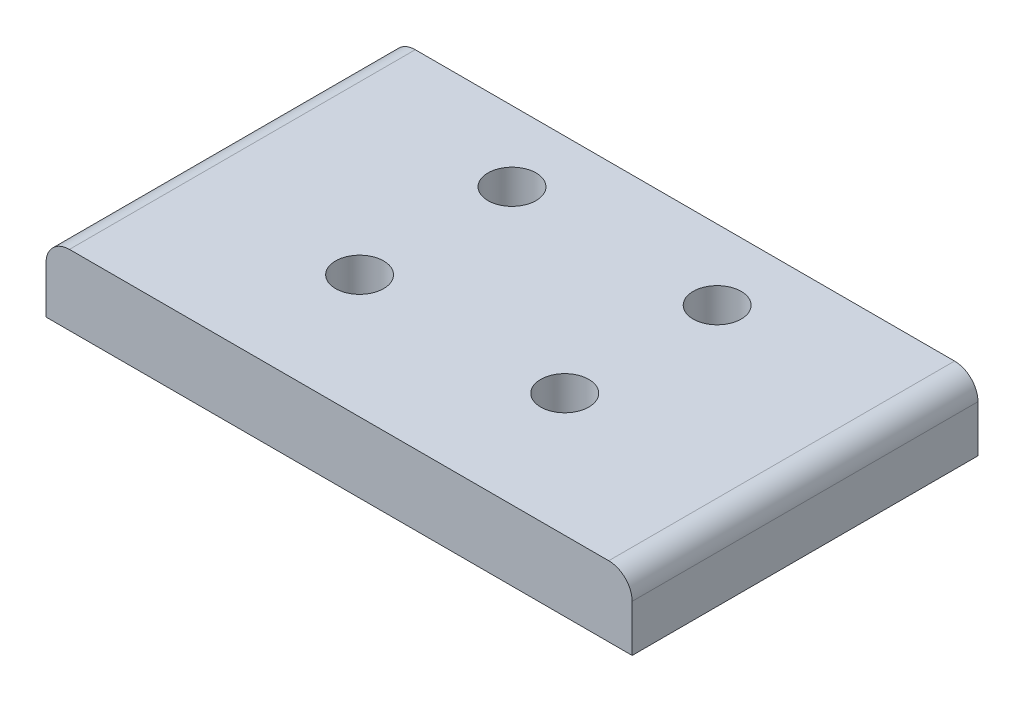
ISO-10303-21;
HEADER;
FILE_DESCRIPTION(('STEP AP214'),'2;1');
FILE_NAME('part.step','',(''),(''),'','','');
FILE_SCHEMA(('AUTOMOTIVE_DESIGN { 1 0 10303 214 1 1 1 1 }'));
ENDSEC;
DATA;
#1=APPLICATION_CONTEXT('core data for automotive mechanical design processes');
#2=APPLICATION_PROTOCOL_DEFINITION('international standard','automotive_design',2000,#1);
#3=PRODUCT_CONTEXT('',#1,'mechanical');
#4=PRODUCT('Part','Part','',(#3));
#5=PRODUCT_RELATED_PRODUCT_CATEGORY('part','',(#4));
#6=PRODUCT_DEFINITION_FORMATION('','',#4);
#7=PRODUCT_DEFINITION_CONTEXT('part definition',#1,'design');
#8=PRODUCT_DEFINITION('design','',#6,#7);
#9=PRODUCT_DEFINITION_SHAPE('','',#8);
#10=(LENGTH_UNIT() NAMED_UNIT(*) SI_UNIT(.MILLI.,.METRE.));
#11=(NAMED_UNIT(*) PLANE_ANGLE_UNIT() SI_UNIT($,.RADIAN.));
#12=(NAMED_UNIT(*) SI_UNIT($,.STERADIAN.) SOLID_ANGLE_UNIT());
#13=UNCERTAINTY_MEASURE_WITH_UNIT(LENGTH_MEASURE(1.E-05),#10,'distance_accuracy_value','');
#14=(GEOMETRIC_REPRESENTATION_CONTEXT(3) GLOBAL_UNCERTAINTY_ASSIGNED_CONTEXT((#13)) GLOBAL_UNIT_ASSIGNED_CONTEXT((#10,
#11,#12)) REPRESENTATION_CONTEXT('',''));
#15=CARTESIAN_POINT('',(0.,0.,0.));
#16=DIRECTION('',(0.,0.,1.));
#17=DIRECTION('',(1.,0.,0.));
#18=AXIS2_PLACEMENT_3D('',#15,#16,#17);
#19=CARTESIAN_POINT('',(50.,6.,0.));
#20=DIRECTION('',(-1.,0.,0.));
#21=DIRECTION('',(0.,0.,1.));
#22=AXIS2_PLACEMENT_3D('',#19,#20,#21);
#23=PLANE('',#22);
#24=DIRECTION('',(0.,-1.,0.));
#25=VECTOR('',#24,1.);
#26=CARTESIAN_POINT('',(50.,6.,-29.5));
#27=LINE('',#26,#25);
#28=CARTESIAN_POINT('',(50.,4.,-29.5));
#29=VERTEX_POINT('',#28);
#30=CARTESIAN_POINT('',(50.,0.,-29.5));
#31=VERTEX_POINT('',#30);
#32=EDGE_CURVE('E90',#29,#31,#27,.T.);
#33=ORIENTED_EDGE('',*,*,#32,.F.);
#34=DIRECTION('',(0.,0.,-1.));
#35=VECTOR('',#34,1.);
#36=CARTESIAN_POINT('',(50.,4.,0.));
#37=LINE('',#36,#35);
#38=CARTESIAN_POINT('',(50.,4.,0.));
#39=VERTEX_POINT('',#38);
#40=EDGE_CURVE('E49',#29,#39,#37,.F.);
#41=ORIENTED_EDGE('',*,*,#40,.T.);
#42=DIRECTION('',(0.,-1.,0.));
#43=VECTOR('',#42,1.);
#44=CARTESIAN_POINT('',(50.,6.,0.));
#45=LINE('',#44,#43);
#46=CARTESIAN_POINT('',(50.,0.,0.));
#47=VERTEX_POINT('',#46);
#48=EDGE_CURVE('E102',#39,#47,#45,.T.);
#49=ORIENTED_EDGE('',*,*,#48,.T.);
#50=DIRECTION('',(0.,0.,-1.));
#51=VECTOR('',#50,1.);
#52=CARTESIAN_POINT('',(50.,0.,0.));
#53=LINE('',#52,#51);
#54=EDGE_CURVE('E101',#47,#31,#53,.T.);
#55=ORIENTED_EDGE('',*,*,#54,.T.);
#56=EDGE_LOOP('',(#33,#41,#49,#55));
#57=FACE_BOUND('',#56,.T.);
#58=ADVANCED_FACE('F41',(#57),#23,.F.);
#59=CARTESIAN_POINT('',(0.,6.,-29.5));
#60=DIRECTION('',(0.,0.,-1.));
#61=DIRECTION('',(-1.,0.,0.));
#62=AXIS2_PLACEMENT_3D('',#59,#60,#61);
#63=PLANE('',#62);
#64=DIRECTION('',(1.,0.,0.));
#65=VECTOR('',#64,1.);
#66=CARTESIAN_POINT('',(0.,6.,-29.5));
#67=LINE('',#66,#65);
#68=CARTESIAN_POINT('',(2.,6.,-29.5));
#69=VERTEX_POINT('',#68);
#70=CARTESIAN_POINT('',(48.,6.,-29.5));
#71=VERTEX_POINT('',#70);
#72=EDGE_CURVE('E117',#69,#71,#67,.T.);
#73=ORIENTED_EDGE('',*,*,#72,.T.);
#74=CARTESIAN_POINT('',(48.,4.,-29.5));
#75=DIRECTION('',(0.,0.,-1.));
#76=DIRECTION('',(-1.,0.,0.));
#77=AXIS2_PLACEMENT_3D('',#74,#75,#76);
#78=CIRCLE('',#77,2.);
#79=EDGE_CURVE('E63',#71,#29,#78,.T.);
#80=ORIENTED_EDGE('',*,*,#79,.T.);
#81=ORIENTED_EDGE('',*,*,#32,.T.);
#82=DIRECTION('',(1.,0.,0.));
#83=VECTOR('',#82,1.);
#84=CARTESIAN_POINT('',(0.,0.,-29.5));
#85=LINE('',#84,#83);
#86=CARTESIAN_POINT('',(0.,0.,-29.5));
#87=VERTEX_POINT('',#86);
#88=EDGE_CURVE('E95',#87,#31,#85,.T.);
#89=ORIENTED_EDGE('',*,*,#88,.F.);
#90=DIRECTION('',(0.,-1.,0.));
#91=VECTOR('',#90,1.);
#92=CARTESIAN_POINT('',(0.,6.,-29.5));
#93=LINE('',#92,#91);
#94=CARTESIAN_POINT('',(0.,4.,-29.5));
#95=VERTEX_POINT('',#94);
#96=EDGE_CURVE('E98',#95,#87,#93,.T.);
#97=ORIENTED_EDGE('',*,*,#96,.F.);
#98=CARTESIAN_POINT('',(2.,4.,-29.5));
#99=DIRECTION('',(0.,0.,-1.));
#100=DIRECTION('',(-1.,0.,0.));
#101=AXIS2_PLACEMENT_3D('',#98,#99,#100);
#102=CIRCLE('',#101,2.);
#103=EDGE_CURVE('E125',#95,#69,#102,.T.);
#104=ORIENTED_EDGE('',*,*,#103,.T.);
#105=EDGE_LOOP('',(#73,#80,#81,#89,#97,#104));
#106=FACE_BOUND('',#105,.T.);
#107=ADVANCED_FACE('F92',(#106),#63,.T.);
#108=CARTESIAN_POINT('',(0.,6.,0.));
#109=DIRECTION('',(-1.,0.,0.));
#110=DIRECTION('',(0.,0.,1.));
#111=AXIS2_PLACEMENT_3D('',#108,#109,#110);
#112=PLANE('',#111);
#113=DIRECTION('',(0.,-1.,0.));
#114=VECTOR('',#113,1.);
#115=CARTESIAN_POINT('',(0.,6.,0.));
#116=LINE('',#115,#114);
#117=CARTESIAN_POINT('',(0.,4.,0.));
#118=VERTEX_POINT('',#117);
#119=CARTESIAN_POINT('',(0.,0.,0.));
#120=VERTEX_POINT('',#119);
#121=EDGE_CURVE('E119',#118,#120,#116,.T.);
#122=ORIENTED_EDGE('',*,*,#121,.F.);
#123=DIRECTION('',(0.,0.,-1.));
#124=VECTOR('',#123,1.);
#125=CARTESIAN_POINT('',(0.,4.,0.));
#126=LINE('',#125,#124);
#127=EDGE_CURVE('E97',#118,#95,#126,.T.);
#128=ORIENTED_EDGE('',*,*,#127,.T.);
#129=ORIENTED_EDGE('',*,*,#96,.T.);
#130=DIRECTION('',(0.,0.,-1.));
#131=VECTOR('',#130,1.);
#132=CARTESIAN_POINT('',(0.,0.,0.));
#133=LINE('',#132,#131);
#134=EDGE_CURVE('E110',#120,#87,#133,.T.);
#135=ORIENTED_EDGE('',*,*,#134,.F.);
#136=EDGE_LOOP('',(#122,#128,#129,#135));
#137=FACE_BOUND('',#136,.T.);
#138=ADVANCED_FACE('F200',(#137),#112,.T.);
#139=CARTESIAN_POINT('',(0.,6.,0.));
#140=DIRECTION('',(0.,0.,-1.));
#141=DIRECTION('',(-1.,0.,0.));
#142=AXIS2_PLACEMENT_3D('',#139,#140,#141);
#143=PLANE('',#142);
#144=ORIENTED_EDGE('',*,*,#48,.F.);
#145=CARTESIAN_POINT('',(48.,4.,0.));
#146=DIRECTION('',(0.,0.,-1.));
#147=DIRECTION('',(-1.,0.,0.));
#148=AXIS2_PLACEMENT_3D('',#145,#146,#147);
#149=CIRCLE('',#148,2.);
#150=CARTESIAN_POINT('',(48.,6.,0.));
#151=VERTEX_POINT('',#150);
#152=EDGE_CURVE('E11',#39,#151,#149,.F.);
#153=ORIENTED_EDGE('',*,*,#152,.T.);
#154=DIRECTION('',(1.,0.,0.));
#155=VECTOR('',#154,1.);
#156=CARTESIAN_POINT('',(0.,6.,0.));
#157=LINE('',#156,#155);
#158=CARTESIAN_POINT('',(2.,6.,0.));
#159=VERTEX_POINT('',#158);
#160=EDGE_CURVE('E120',#159,#151,#157,.T.);
#161=ORIENTED_EDGE('',*,*,#160,.F.);
#162=CARTESIAN_POINT('',(2.,4.,0.));
#163=DIRECTION('',(0.,0.,-1.));
#164=DIRECTION('',(-1.,0.,0.));
#165=AXIS2_PLACEMENT_3D('',#162,#163,#164);
#166=CIRCLE('',#165,2.);
#167=EDGE_CURVE('E129',#159,#118,#166,.F.);
#168=ORIENTED_EDGE('',*,*,#167,.T.);
#169=ORIENTED_EDGE('',*,*,#121,.T.);
#170=DIRECTION('',(1.,0.,0.));
#171=VECTOR('',#170,1.);
#172=CARTESIAN_POINT('',(0.,0.,0.));
#173=LINE('',#172,#171);
#174=EDGE_CURVE('E112',#120,#47,#173,.T.);
#175=ORIENTED_EDGE('',*,*,#174,.T.);
#176=EDGE_LOOP('',(#144,#153,#161,#168,#169,#175));
#177=FACE_BOUND('',#176,.T.);
#178=ADVANCED_FACE('F211',(#177),#143,.F.);
#179=CARTESIAN_POINT('',(0.,6.,0.));
#180=DIRECTION('',(0.,1.,0.));
#181=DIRECTION('',(0.,0.,1.));
#182=AXIS2_PLACEMENT_3D('',#179,#180,#181);
#183=PLANE('',#182);
#184=CARTESIAN_POINT('',(16.25,6.,-23.5));
#185=DIRECTION('',(0.,-1.,0.));
#186=DIRECTION('',(0.,0.,-1.));
#187=AXIS2_PLACEMENT_3D('',#184,#185,#186);
#188=CIRCLE('',#187,2.05);
#189=CARTESIAN_POINT('',(16.25,6.,-25.55));
#190=VERTEX_POINT('',#189);
#191=EDGE_CURVE('E162',#190,#190,#188,.T.);
#192=ORIENTED_EDGE('',*,*,#191,.T.);
#193=EDGE_LOOP('',(#192));
#194=FACE_BOUND('',#193,.T.);
#195=CARTESIAN_POINT('',(33.75,6.,-23.5));
#196=DIRECTION('',(0.,-1.,0.));
#197=DIRECTION('',(0.,0.,-1.));
#198=AXIS2_PLACEMENT_3D('',#195,#196,#197);
#199=CIRCLE('',#198,2.05);
#200=CARTESIAN_POINT('',(33.75,6.,-25.55));
#201=VERTEX_POINT('',#200);
#202=EDGE_CURVE('E156',#201,#201,#199,.T.);
#203=ORIENTED_EDGE('',*,*,#202,.T.);
#204=EDGE_LOOP('',(#203));
#205=FACE_BOUND('',#204,.T.);
#206=CARTESIAN_POINT('',(33.75,6.,-10.5));
#207=DIRECTION('',(0.,-1.,0.));
#208=DIRECTION('',(0.,0.,-1.));
#209=AXIS2_PLACEMENT_3D('',#206,#207,#208);
#210=CIRCLE('',#209,2.05);
#211=CARTESIAN_POINT('',(33.75,6.,-12.55));
#212=VERTEX_POINT('',#211);
#213=EDGE_CURVE('E150',#212,#212,#210,.T.);
#214=ORIENTED_EDGE('',*,*,#213,.T.);
#215=EDGE_LOOP('',(#214));
#216=FACE_BOUND('',#215,.T.);
#217=CARTESIAN_POINT('',(16.25,6.,-10.5));
#218=DIRECTION('',(0.,-1.,0.));
#219=DIRECTION('',(0.,0.,-1.));
#220=AXIS2_PLACEMENT_3D('',#217,#218,#219);
#221=CIRCLE('',#220,2.05);
#222=CARTESIAN_POINT('',(16.25,6.,-12.55));
#223=VERTEX_POINT('',#222);
#224=EDGE_CURVE('E106',#223,#223,#221,.T.);
#225=ORIENTED_EDGE('',*,*,#224,.T.);
#226=EDGE_LOOP('',(#225));
#227=FACE_BOUND('',#226,.T.);
#228=ORIENTED_EDGE('',*,*,#160,.T.);
#229=DIRECTION('',(0.,0.,-1.));
#230=VECTOR('',#229,1.);
#231=CARTESIAN_POINT('',(48.,6.,-29.5));
#232=LINE('',#231,#230);
#233=EDGE_CURVE('E131',#151,#71,#232,.T.);
#234=ORIENTED_EDGE('',*,*,#233,.T.);
#235=ORIENTED_EDGE('',*,*,#72,.F.);
#236=DIRECTION('',(0.,0.,-1.));
#237=VECTOR('',#236,1.);
#238=CARTESIAN_POINT('',(2.,6.,0.));
#239=LINE('',#238,#237);
#240=EDGE_CURVE('E127',#69,#159,#239,.F.);
#241=ORIENTED_EDGE('',*,*,#240,.T.);
#242=EDGE_LOOP('',(#228,#234,#235,#241));
#243=FACE_BOUND('',#242,.T.);
#244=ADVANCED_FACE('F138',(#194,#205,#216,#227,#243),#183,.T.);
#245=CARTESIAN_POINT('',(0.,0.,0.));
#246=DIRECTION('',(0.,1.,0.));
#247=DIRECTION('',(0.,0.,1.));
#248=AXIS2_PLACEMENT_3D('',#245,#246,#247);
#249=PLANE('',#248);
#250=CARTESIAN_POINT('',(16.25,0.,-23.5));
#251=DIRECTION('',(0.,-1.,0.));
#252=DIRECTION('',(0.,0.,-1.));
#253=AXIS2_PLACEMENT_3D('',#250,#251,#252);
#254=CIRCLE('',#253,2.05);
#255=CARTESIAN_POINT('',(16.25,0.,-25.55));
#256=VERTEX_POINT('',#255);
#257=EDGE_CURVE('E165',#256,#256,#254,.T.);
#258=ORIENTED_EDGE('',*,*,#257,.F.);
#259=EDGE_LOOP('',(#258));
#260=FACE_BOUND('',#259,.T.);
#261=CARTESIAN_POINT('',(33.75,0.,-23.5));
#262=DIRECTION('',(0.,-1.,0.));
#263=DIRECTION('',(0.,0.,-1.));
#264=AXIS2_PLACEMENT_3D('',#261,#262,#263);
#265=CIRCLE('',#264,2.05);
#266=CARTESIAN_POINT('',(33.75,0.,-25.55));
#267=VERTEX_POINT('',#266);
#268=EDGE_CURVE('E159',#267,#267,#265,.T.);
#269=ORIENTED_EDGE('',*,*,#268,.F.);
#270=EDGE_LOOP('',(#269));
#271=FACE_BOUND('',#270,.T.);
#272=CARTESIAN_POINT('',(33.75,0.,-10.5));
#273=DIRECTION('',(0.,-1.,0.));
#274=DIRECTION('',(0.,0.,-1.));
#275=AXIS2_PLACEMENT_3D('',#272,#273,#274);
#276=CIRCLE('',#275,2.05);
#277=CARTESIAN_POINT('',(33.75,0.,-12.55));
#278=VERTEX_POINT('',#277);
#279=EDGE_CURVE('E153',#278,#278,#276,.T.);
#280=ORIENTED_EDGE('',*,*,#279,.F.);
#281=EDGE_LOOP('',(#280));
#282=FACE_BOUND('',#281,.T.);
#283=CARTESIAN_POINT('',(16.25,0.,-10.5));
#284=DIRECTION('',(0.,-1.,0.));
#285=DIRECTION('',(0.,0.,-1.));
#286=AXIS2_PLACEMENT_3D('',#283,#284,#285);
#287=CIRCLE('',#286,2.05);
#288=CARTESIAN_POINT('',(16.25,0.,-12.55));
#289=VERTEX_POINT('',#288);
#290=EDGE_CURVE('E147',#289,#289,#287,.T.);
#291=ORIENTED_EDGE('',*,*,#290,.F.);
#292=EDGE_LOOP('',(#291));
#293=FACE_BOUND('',#292,.T.);
#294=ORIENTED_EDGE('',*,*,#54,.F.);
#295=ORIENTED_EDGE('',*,*,#174,.F.);
#296=ORIENTED_EDGE('',*,*,#134,.T.);
#297=ORIENTED_EDGE('',*,*,#88,.T.);
#298=EDGE_LOOP('',(#294,#295,#296,#297));
#299=FACE_BOUND('',#298,.T.);
#300=ADVANCED_FACE('F108',(#260,#271,#282,#293,#299),#249,.F.);
#301=CARTESIAN_POINT('',(2.,4.,0.));
#302=DIRECTION('',(0.,0.,-1.));
#303=DIRECTION('',(-1.,0.,0.));
#304=AXIS2_PLACEMENT_3D('',#301,#302,#303);
#305=CYLINDRICAL_SURFACE('',#304,2.);
#306=ORIENTED_EDGE('',*,*,#167,.F.);
#307=ORIENTED_EDGE('',*,*,#240,.F.);
#308=ORIENTED_EDGE('',*,*,#103,.F.);
#309=ORIENTED_EDGE('',*,*,#127,.F.);
#310=EDGE_LOOP('',(#306,#307,#308,#309));
#311=FACE_BOUND('',#310,.T.);
#312=ADVANCED_FACE('F173',(#311),#305,.T.);
#313=CARTESIAN_POINT('',(48.,4.,0.));
#314=DIRECTION('',(0.,0.,1.));
#315=DIRECTION('',(1.,0.,0.));
#316=AXIS2_PLACEMENT_3D('',#313,#314,#315);
#317=CYLINDRICAL_SURFACE('',#316,2.);
#318=ORIENTED_EDGE('',*,*,#152,.F.);
#319=ORIENTED_EDGE('',*,*,#40,.F.);
#320=ORIENTED_EDGE('',*,*,#79,.F.);
#321=ORIENTED_EDGE('',*,*,#233,.F.);
#322=EDGE_LOOP('',(#318,#319,#320,#321));
#323=FACE_BOUND('',#322,.T.);
#324=ADVANCED_FACE('F43',(#323),#317,.T.);
#325=CARTESIAN_POINT('',(16.25,0.,-10.5));
#326=DIRECTION('',(0.,-1.,0.));
#327=DIRECTION('',(0.,0.,-1.));
#328=AXIS2_PLACEMENT_3D('',#325,#326,#327);
#329=CYLINDRICAL_SURFACE('',#328,2.05);
#330=ORIENTED_EDGE('',*,*,#224,.F.);
#331=EDGE_LOOP('',(#330));
#332=FACE_BOUND('',#331,.T.);
#333=ORIENTED_EDGE('',*,*,#290,.T.);
#334=EDGE_LOOP('',(#333));
#335=FACE_BOUND('',#334,.T.);
#336=ADVANCED_FACE('F181',(#332,#335),#329,.F.);
#337=CARTESIAN_POINT('',(33.75,0.,-10.5));
#338=DIRECTION('',(0.,-1.,0.));
#339=DIRECTION('',(0.,0.,-1.));
#340=AXIS2_PLACEMENT_3D('',#337,#338,#339);
#341=CYLINDRICAL_SURFACE('',#340,2.05);
#342=ORIENTED_EDGE('',*,*,#213,.F.);
#343=EDGE_LOOP('',(#342));
#344=FACE_BOUND('',#343,.T.);
#345=ORIENTED_EDGE('',*,*,#279,.T.);
#346=EDGE_LOOP('',(#345));
#347=FACE_BOUND('',#346,.T.);
#348=ADVANCED_FACE('F183',(#344,#347),#341,.F.);
#349=CARTESIAN_POINT('',(33.75,0.,-23.5));
#350=DIRECTION('',(0.,-1.,0.));
#351=DIRECTION('',(0.,0.,-1.));
#352=AXIS2_PLACEMENT_3D('',#349,#350,#351);
#353=CYLINDRICAL_SURFACE('',#352,2.05);
#354=ORIENTED_EDGE('',*,*,#202,.F.);
#355=EDGE_LOOP('',(#354));
#356=FACE_BOUND('',#355,.T.);
#357=ORIENTED_EDGE('',*,*,#268,.T.);
#358=EDGE_LOOP('',(#357));
#359=FACE_BOUND('',#358,.T.);
#360=ADVANCED_FACE('F190',(#356,#359),#353,.F.);
#361=CARTESIAN_POINT('',(16.25,0.,-23.5));
#362=DIRECTION('',(0.,-1.,0.));
#363=DIRECTION('',(0.,0.,-1.));
#364=AXIS2_PLACEMENT_3D('',#361,#362,#363);
#365=CYLINDRICAL_SURFACE('',#364,2.05);
#366=ORIENTED_EDGE('',*,*,#191,.F.);
#367=EDGE_LOOP('',(#366));
#368=FACE_BOUND('',#367,.T.);
#369=ORIENTED_EDGE('',*,*,#257,.T.);
#370=EDGE_LOOP('',(#369));
#371=FACE_BOUND('',#370,.T.);
#372=ADVANCED_FACE('F169',(#368,#371),#365,.F.);
#373=CLOSED_SHELL('',(#58,#107,#138,#178,#244,#300,#312,#324,#336,#348,#360,#372));
#374=MANIFOLD_SOLID_BREP('B2',#373);
#375=ADVANCED_BREP_SHAPE_REPRESENTATION('',(#18,#374),#14);
#376=SHAPE_DEFINITION_REPRESENTATION(#9,#375);
ENDSEC;
END-ISO-10303-21;
